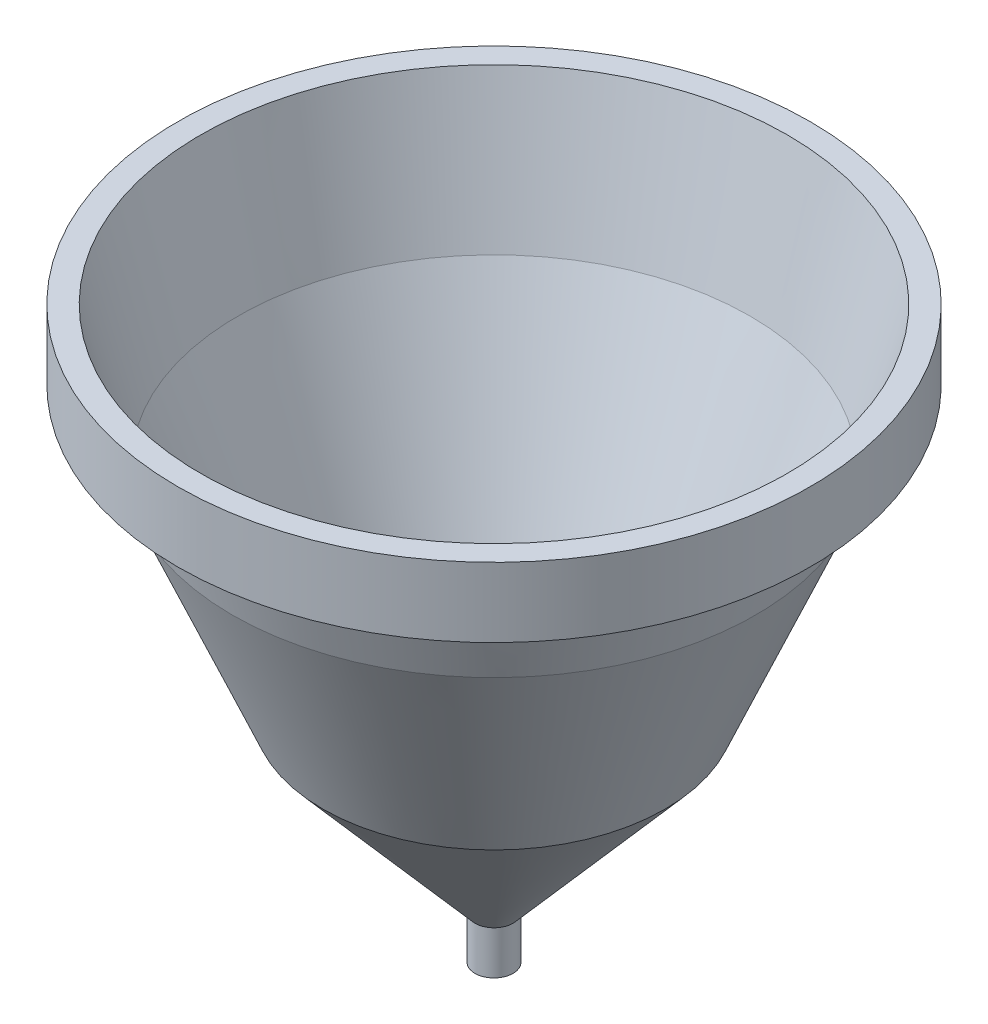
ISO-10303-21;
HEADER;
FILE_DESCRIPTION(('STEP AP214'),'2;1');
FILE_NAME('part.step','',(''),(''),'','','');
FILE_SCHEMA(('AUTOMOTIVE_DESIGN { 1 0 10303 214 1 1 1 1 }'));
ENDSEC;
DATA;
#1=APPLICATION_CONTEXT('core data for automotive mechanical design processes');
#2=APPLICATION_PROTOCOL_DEFINITION('international standard','automotive_design',2000,#1);
#3=PRODUCT_CONTEXT('',#1,'mechanical');
#4=PRODUCT('Part','Part','',(#3));
#5=PRODUCT_RELATED_PRODUCT_CATEGORY('part','',(#4));
#6=PRODUCT_DEFINITION_FORMATION('','',#4);
#7=PRODUCT_DEFINITION_CONTEXT('part definition',#1,'design');
#8=PRODUCT_DEFINITION('design','',#6,#7);
#9=PRODUCT_DEFINITION_SHAPE('','',#8);
#10=(LENGTH_UNIT() NAMED_UNIT(*) SI_UNIT(.MILLI.,.METRE.));
#11=(NAMED_UNIT(*) PLANE_ANGLE_UNIT() SI_UNIT($,.RADIAN.));
#12=(NAMED_UNIT(*) SI_UNIT($,.STERADIAN.) SOLID_ANGLE_UNIT());
#13=UNCERTAINTY_MEASURE_WITH_UNIT(LENGTH_MEASURE(1.E-05),#10,'distance_accuracy_value','');
#14=(GEOMETRIC_REPRESENTATION_CONTEXT(3) GLOBAL_UNCERTAINTY_ASSIGNED_CONTEXT((#13)) GLOBAL_UNIT_ASSIGNED_CONTEXT((#10,
#11,#12)) REPRESENTATION_CONTEXT('',''));
#15=CARTESIAN_POINT('',(0.,0.,0.));
#16=DIRECTION('',(0.,0.,1.));
#17=DIRECTION('',(1.,0.,0.));
#18=AXIS2_PLACEMENT_3D('',#15,#16,#17);
#19=CARTESIAN_POINT('',(0.,-3.39281603613767,-30.7702271495571));
#20=DIRECTION('',(0.,-1.,0.));
#21=DIRECTION('',(0.,0.,-1.));
#22=AXIS2_PLACEMENT_3D('',#19,#20,#21);
#23=CYLINDRICAL_SURFACE('',#22,6.57712423259411);
#24=CARTESIAN_POINT('',(0.,-3.2622655549078,-30.7702271495571));
#25=DIRECTION('',(0.,-1.,0.));
#26=DIRECTION('',(0.,0.,-1.));
#27=AXIS2_PLACEMENT_3D('',#24,#25,#26);
#28=CIRCLE('',#27,6.57712423259412);
#29=CARTESIAN_POINT('',(0.,-3.2622655549078,-37.3473513821513));
#30=VERTEX_POINT('',#29);
#31=EDGE_CURVE('E10',#30,#30,#28,.T.);
#32=ORIENTED_EDGE('',*,*,#31,.F.);
#33=EDGE_LOOP('',(#32));
#34=FACE_BOUND('',#33,.T.);
#35=CARTESIAN_POINT('',(0.,11.7377344450922,-30.7702271495571));
#36=DIRECTION('',(0.,-1.,0.));
#37=DIRECTION('',(0.,0.,-1.));
#38=AXIS2_PLACEMENT_3D('',#35,#36,#37);
#39=CIRCLE('',#38,6.57712423259411);
#40=CARTESIAN_POINT('',(0.,11.7377344450922,-24.193102916963));
#41=VERTEX_POINT('',#40);
#42=EDGE_CURVE('E82',#41,#41,#39,.T.);
#43=ORIENTED_EDGE('',*,*,#42,.T.);
#44=EDGE_LOOP('',(#43));
#45=FACE_BOUND('',#44,.T.);
#46=ADVANCED_FACE('F36',(#34,#45),#23,.T.);
#47=CARTESIAN_POINT('',(0.,-3.2622655549078,-30.7702271495571));
#48=DIRECTION('',(0.,1.,0.));
#49=DIRECTION('',(0.,0.,1.));
#50=AXIS2_PLACEMENT_3D('',#47,#48,#49);
#51=CONICAL_SURFACE('',#50,6.57712423259412,1.48820706982176);
#52=CARTESIAN_POINT('',(0.,-3.39281603613767,-30.7702271495571));
#53=DIRECTION('',(0.,-1.,0.));
#54=DIRECTION('',(0.,0.,-1.));
#55=AXIS2_PLACEMENT_3D('',#52,#53,#54);
#56=CIRCLE('',#55,4.99999999999997);
#57=CARTESIAN_POINT('',(0.,-3.39281603613767,-35.7702271495571));
#58=VERTEX_POINT('',#57);
#59=EDGE_CURVE('E42',#58,#58,#56,.T.);
#60=ORIENTED_EDGE('',*,*,#59,.F.);
#61=EDGE_LOOP('',(#60));
#62=FACE_BOUND('',#61,.T.);
#63=ORIENTED_EDGE('',*,*,#31,.T.);
#64=EDGE_LOOP('',(#63));
#65=FACE_BOUND('',#64,.T.);
#66=ADVANCED_FACE('F123',(#62,#65),#51,.T.);
#67=CARTESIAN_POINT('',(0.,-3.39281603613767,-30.7702271495571));
#68=DIRECTION('',(0.,-1.,0.));
#69=DIRECTION('',(0.,0.,-1.));
#70=AXIS2_PLACEMENT_3D('',#67,#68,#69);
#71=CYLINDRICAL_SURFACE('',#70,4.99999999999997);
#72=ORIENTED_EDGE('',*,*,#59,.T.);
#73=EDGE_LOOP('',(#72));
#74=FACE_BOUND('',#73,.T.);
#75=CARTESIAN_POINT('',(0.,12.4071839638624,-30.7702271495571));
#76=DIRECTION('',(0.,-1.,0.));
#77=DIRECTION('',(0.,0.,-1.));
#78=AXIS2_PLACEMENT_3D('',#75,#76,#77);
#79=CIRCLE('',#78,4.99999999999998);
#80=CARTESIAN_POINT('',(0.,12.4071839638624,-25.7702271495572));
#81=VERTEX_POINT('',#80);
#82=EDGE_CURVE('E46',#81,#81,#79,.T.);
#83=ORIENTED_EDGE('',*,*,#82,.F.);
#84=EDGE_LOOP('',(#83));
#85=FACE_BOUND('',#84,.T.);
#86=ADVANCED_FACE('F128',(#74,#85),#71,.F.);
#87=CARTESIAN_POINT('',(0.,72.783950381684,-30.7702271495571));
#88=DIRECTION('',(0.,1.,0.));
#89=DIRECTION('',(0.,0.,1.));
#90=AXIS2_PLACEMENT_3D('',#87,#88,#89);
#91=CONICAL_SURFACE('',#90,57.4847223192407,0.715584993317677);
#92=CARTESIAN_POINT('',(0.,72.783950381684,-30.7702271495571));
#93=DIRECTION('',(0.,-1.,0.));
#94=DIRECTION('',(0.,0.,-1.));
#95=AXIS2_PLACEMENT_3D('',#92,#93,#94);
#96=CIRCLE('',#95,57.4847223192407);
#97=CARTESIAN_POINT('',(0.,72.783950381684,26.7144951696836));
#98=VERTEX_POINT('',#97);
#99=EDGE_CURVE('E50',#98,#98,#96,.T.);
#100=CARTESIAN_POINT('',(0.,12.4071839638624,-25.7702271495572));
#101=CARTESIAN_POINT('',(0.,13.036108614048,-25.2235112920651));
#102=CARTESIAN_POINT('',(0.,13.6650332642336,-24.676795434573));
#103=CARTESIAN_POINT('',(0.,14.9228825646049,-23.5833637195888));
#104=CARTESIAN_POINT('',(0.,15.5518072147906,-23.0366478620967));
#105=CARTESIAN_POINT('',(0.,16.8096565151618,-21.9432161471125));
#106=CARTESIAN_POINT('',(0.,17.4385811653475,-21.3965002896204));
#107=CARTESIAN_POINT('',(0.,18.6964304657188,-20.3030685746363));
#108=CARTESIAN_POINT('',(0.,19.3253551159044,-19.7563527171442));
#109=CARTESIAN_POINT('',(0.,20.5832044162757,-18.66292100216));
#110=CARTESIAN_POINT('',(0.,21.2121290664613,-18.1162051446679));
#111=CARTESIAN_POINT('',(0.,22.4699783668326,-17.0227734296837));
#112=CARTESIAN_POINT('',(0.,23.0989030170183,-16.4760575721916));
#113=CARTESIAN_POINT('',(0.,24.3567523173896,-15.3826258572074));
#114=CARTESIAN_POINT('',(0.,24.9856769675752,-14.8359099997154));
#115=CARTESIAN_POINT('',(0.,26.2435262679465,-13.7424782847312));
#116=CARTESIAN_POINT('',(0.,26.8724509181321,-13.1957624272391));
#117=CARTESIAN_POINT('',(0.,28.1303002185034,-12.1023307122549));
#118=CARTESIAN_POINT('',(0.,28.7592248686891,-11.5556148547628));
#119=CARTESIAN_POINT('',(0.,30.0170741690603,-10.4621831397786));
#120=CARTESIAN_POINT('',(0.,30.645998819246,-9.91546728228653));
#121=CARTESIAN_POINT('',(0.,31.9038481196173,-8.82203556730235));
#122=CARTESIAN_POINT('',(0.,32.5327727698029,-8.27531970981026));
#123=CARTESIAN_POINT('',(0.,33.7906220701742,-7.18188799482608));
#124=CARTESIAN_POINT('',(0.,34.4195467203598,-6.63517213733398));
#125=CARTESIAN_POINT('',(0.,35.6773960207311,-5.5417404223498));
#126=CARTESIAN_POINT('',(0.,36.3063206709168,-4.99502456485771));
#127=CARTESIAN_POINT('',(0.,37.564169971288,-3.90159284987353));
#128=CARTESIAN_POINT('',(0.,38.1930946214737,-3.35487699238144));
#129=CARTESIAN_POINT('',(0.,39.450943921845,-2.26144527739725));
#130=CARTESIAN_POINT('',(0.,40.0798685720306,-1.71472941990516));
#131=CARTESIAN_POINT('',(0.,41.3377178724019,-0.621297704920985));
#132=CARTESIAN_POINT('',(0.,41.9666425225875,-0.0745818474288936));
#133=CARTESIAN_POINT('',(0.,43.2244918229588,1.01884986755529));
#134=CARTESIAN_POINT('',(0.,43.8534164731445,1.56556572504738));
#135=CARTESIAN_POINT('',(0.,45.1112657735158,2.65899744003157));
#136=CARTESIAN_POINT('',(0.,45.7401904237014,3.20571329752366));
#137=CARTESIAN_POINT('',(0.,46.9980397240727,4.29914501250783));
#138=CARTESIAN_POINT('',(0.,47.6269643742583,4.84586086999992));
#139=CARTESIAN_POINT('',(0.,48.8848136746296,5.9392925849841));
#140=CARTESIAN_POINT('',(0.,49.5137383248152,6.4860084424762));
#141=CARTESIAN_POINT('',(0.,50.7715876251865,7.57944015746038));
#142=CARTESIAN_POINT('',(0.,51.4005122753722,8.12615601495248));
#143=CARTESIAN_POINT('',(0.,52.6583615757435,9.21958772993666));
#144=CARTESIAN_POINT('',(0.,53.2872862259291,9.76630358742874));
#145=CARTESIAN_POINT('',(0.,54.5451355263004,10.8597353024129));
#146=CARTESIAN_POINT('',(0.,55.174060176486,11.406451159905));
#147=CARTESIAN_POINT('',(0.,56.4319094768573,12.4998828748892));
#148=CARTESIAN_POINT('',(0.,57.060834127043,13.0465987323813));
#149=CARTESIAN_POINT('',(0.,58.3186834274142,14.1400304473655));
#150=CARTESIAN_POINT('',(0.,58.9476080775999,14.6867463048576));
#151=CARTESIAN_POINT('',(0.,60.2054573779712,15.7801780198417));
#152=CARTESIAN_POINT('',(0.,60.8343820281568,16.3268938773338));
#153=CARTESIAN_POINT('',(0.,62.0922313285281,17.420325592318));
#154=CARTESIAN_POINT('',(0.,62.7211559787137,17.9670414498101));
#155=CARTESIAN_POINT('',(0.,63.979005279085,19.0604731647943));
#156=CARTESIAN_POINT('',(0.,64.6079299292707,19.6071890222864));
#157=CARTESIAN_POINT('',(0.,65.8657792296419,20.7006207372706));
#158=CARTESIAN_POINT('',(0.,66.4947038798276,21.2473365947627));
#159=CARTESIAN_POINT('',(0.,67.7525531801989,22.3407683097468));
#160=CARTESIAN_POINT('',(0.,68.3814778303845,22.8874841672389));
#161=CARTESIAN_POINT('',(0.,69.6393271307558,23.9809158822231));
#162=CARTESIAN_POINT('',(0.,70.2682517809414,24.5276317397152));
#163=CARTESIAN_POINT('',(0.,71.5261010813127,25.6210634546994));
#164=CARTESIAN_POINT('',(0.,72.1550257314984,26.1677793121915));
#165=CARTESIAN_POINT('',(0.,72.783950381684,26.7144951696836));
#166=B_SPLINE_CURVE_WITH_KNOTS('',3,(#100,#101,#102,#103,#104,#105,#106,#107,#108,#109,#110,
#111,#112,#113,#114,#115,#116,#117,#118,#119,#120,#121,#122,#123,#124,#125,#126,#127,#128,#129,
#130,#131,#132,#133,#134,#135,#136,#137,#138,#139,#140,#141,#142,#143,#144,#145,#146,#147,#148,
#149,#150,#151,#152,#153,#154,#155,#156,#157,#158,#159,#160,#161,#162,#163,#164,#165),
.UNSPECIFIED.,.F.,.F.,(4,2,2,2,2,2,2,2,2,2,2,2,2,2,2,2,2,2,2,2,2,2,2,2,2,2,2,2,2,2,2,2,4),(0.,
2.5,5.,7.5,10.,12.5,15.,17.5,20.,22.5,25.,27.5,30.,32.5,35.,37.5,40.,42.5,45.,47.5,50.,52.5,55.,
57.5,60.,62.5,65.,67.5,70.,72.5,75.,77.5,80.),.UNSPECIFIED.);
#167=EDGE_CURVE('BSEAM133',#81,#98,#166,.T.);
#168=ORIENTED_EDGE('',*,*,#82,.T.);
#169=ORIENTED_EDGE('',*,*,#99,.F.);
#170=ORIENTED_EDGE('',*,*,#167,.T.);
#171=ORIENTED_EDGE('',*,*,#167,.F.);
#172=EDGE_LOOP('',(#168,#170,#169,#171));
#173=FACE_BOUND('',#172,.T.);
#174=ADVANCED_FACE('F133',(#173),#91,.F.);
#175=CARTESIAN_POINT('',(0.,145.754889139109,-30.7702271495571));
#176=DIRECTION('',(0.,1.,0.));
#177=DIRECTION('',(0.,0.,1.));
#178=AXIS2_PLACEMENT_3D('',#175,#176,#177);
#179=CONICAL_SURFACE('',#178,88.4590481369411,0.401425727958697);
#180=ORIENTED_EDGE('',*,*,#99,.T.);
#181=EDGE_LOOP('',(#180));
#182=FACE_BOUND('',#181,.T.);
#183=CARTESIAN_POINT('',(0.,145.754889139109,-30.7702271495571));
#184=DIRECTION('',(0.,-1.,0.));
#185=DIRECTION('',(0.,0.,-1.));
#186=AXIS2_PLACEMENT_3D('',#183,#184,#185);
#187=CIRCLE('',#186,88.4590481369411);
#188=CARTESIAN_POINT('',(0.,145.754889139109,-119.229275286498));
#189=VERTEX_POINT('',#188);
#190=EDGE_CURVE('E55',#189,#189,#187,.T.);
#191=ORIENTED_EDGE('',*,*,#190,.F.);
#192=EDGE_LOOP('',(#191));
#193=FACE_BOUND('',#192,.T.);
#194=ADVANCED_FACE('F138',(#182,#193),#179,.F.);
#195=CARTESIAN_POINT('',(0.,193.562293059226,-30.7702271495571));
#196=DIRECTION('',(0.,1.,0.));
#197=DIRECTION('',(0.,0.,1.));
#198=AXIS2_PLACEMENT_3D('',#195,#196,#197);
#199=CONICAL_SURFACE('',#198,101.269003409565,0.26179938779915);
#200=ORIENTED_EDGE('',*,*,#190,.T.);
#201=EDGE_LOOP('',(#200));
#202=FACE_BOUND('',#201,.T.);
#203=CARTESIAN_POINT('',(0.,193.562293059226,-30.7702271495571));
#204=DIRECTION('',(0.,-1.,0.));
#205=DIRECTION('',(0.,0.,-1.));
#206=AXIS2_PLACEMENT_3D('',#203,#204,#205);
#207=CIRCLE('',#206,101.269003409565);
#208=CARTESIAN_POINT('',(0.,193.562293059226,-132.039230559122));
#209=VERTEX_POINT('',#208);
#210=EDGE_CURVE('E58',#209,#209,#207,.T.);
#211=ORIENTED_EDGE('',*,*,#210,.F.);
#212=EDGE_LOOP('',(#211));
#213=FACE_BOUND('',#212,.T.);
#214=ADVANCED_FACE('F142',(#202,#213),#199,.F.);
#215=CARTESIAN_POINT('',(0.,193.562293059226,0.));
#216=DIRECTION('',(0.,-1.,0.));
#217=DIRECTION('',(0.,0.,-1.));
#218=AXIS2_PLACEMENT_3D('',#215,#216,#217);
#219=PLANE('',#218);
#220=CARTESIAN_POINT('',(0.,193.562293059226,-30.7702271495571));
#221=DIRECTION('',(0.,-1.,0.));
#222=DIRECTION('',(0.,0.,-1.));
#223=AXIS2_PLACEMENT_3D('',#220,#221,#222);
#224=CIRCLE('',#223,109.179003409565);
#225=CARTESIAN_POINT('',(0.,193.562293059226,-139.949230559122));
#226=VERTEX_POINT('',#225);
#227=EDGE_CURVE('E61',#226,#226,#224,.T.);
#228=ORIENTED_EDGE('',*,*,#227,.F.);
#229=EDGE_LOOP('',(#228));
#230=FACE_BOUND('',#229,.T.);
#231=ORIENTED_EDGE('',*,*,#210,.T.);
#232=EDGE_LOOP('',(#231));
#233=FACE_BOUND('',#232,.T.);
#234=ADVANCED_FACE('F146',(#230,#233),#219,.F.);
#235=CARTESIAN_POINT('',(0.,-3.39281603613767,-30.7702271495571));
#236=DIRECTION('',(0.,-1.,0.));
#237=DIRECTION('',(0.,0.,-1.));
#238=AXIS2_PLACEMENT_3D('',#235,#236,#237);
#239=CYLINDRICAL_SURFACE('',#238,109.179003409565);
#240=ORIENTED_EDGE('',*,*,#227,.T.);
#241=EDGE_LOOP('',(#240));
#242=FACE_BOUND('',#241,.T.);
#243=CARTESIAN_POINT('',(0.,169.562293059226,-30.7702271495571));
#244=DIRECTION('',(0.,-1.,0.));
#245=DIRECTION('',(0.,0.,-1.));
#246=AXIS2_PLACEMENT_3D('',#243,#244,#245);
#247=CIRCLE('',#246,109.179003409565);
#248=CARTESIAN_POINT('',(0.,169.562293059226,-139.949230559122));
#249=VERTEX_POINT('',#248);
#250=EDGE_CURVE('E64',#249,#249,#247,.T.);
#251=ORIENTED_EDGE('',*,*,#250,.F.);
#252=EDGE_LOOP('',(#251));
#253=FACE_BOUND('',#252,.T.);
#254=ADVANCED_FACE('F119',(#242,#253),#239,.T.);
#255=CARTESIAN_POINT('',(0.,169.562293059226,0.));
#256=DIRECTION('',(0.,-1.,0.));
#257=DIRECTION('',(0.,0.,-1.));
#258=AXIS2_PLACEMENT_3D('',#255,#256,#257);
#259=PLANE('',#258);
#260=ORIENTED_EDGE('',*,*,#250,.T.);
#261=EDGE_LOOP('',(#260));
#262=FACE_BOUND('',#261,.T.);
#263=CARTESIAN_POINT('',(0.,169.562293059226,-30.7702271495571));
#264=DIRECTION('',(0.,-1.,0.));
#265=DIRECTION('',(0.,0.,-1.));
#266=AXIS2_PLACEMENT_3D('',#263,#264,#265);
#267=CIRCLE('',#266,107.379003409565);
#268=CARTESIAN_POINT('',(0.,169.562293059226,-138.149230559122));
#269=VERTEX_POINT('',#268);
#270=EDGE_CURVE('E67',#269,#269,#267,.T.);
#271=ORIENTED_EDGE('',*,*,#270,.F.);
#272=EDGE_LOOP('',(#271));
#273=FACE_BOUND('',#272,.T.);
#274=ADVANCED_FACE('F113',(#262,#273),#259,.T.);
#275=CARTESIAN_POINT('',(0.,-3.39281603613767,-30.7702271495571));
#276=DIRECTION('',(0.,-1.,0.));
#277=DIRECTION('',(0.,0.,-1.));
#278=AXIS2_PLACEMENT_3D('',#275,#276,#277);
#279=CYLINDRICAL_SURFACE('',#278,107.379003409565);
#280=ORIENTED_EDGE('',*,*,#270,.T.);
#281=EDGE_LOOP('',(#280));
#282=FACE_BOUND('',#281,.T.);
#283=CARTESIAN_POINT('',(0.,179.562293059227,-30.7702271495571));
#284=DIRECTION('',(0.,-1.,0.));
#285=DIRECTION('',(0.,0.,-1.));
#286=AXIS2_PLACEMENT_3D('',#283,#284,#285);
#287=CIRCLE('',#286,107.379003409565);
#288=CARTESIAN_POINT('',(0.,179.562293059227,-138.149230559122));
#289=VERTEX_POINT('',#288);
#290=EDGE_CURVE('E70',#289,#289,#287,.T.);
#291=ORIENTED_EDGE('',*,*,#290,.F.);
#292=EDGE_LOOP('',(#291));
#293=FACE_BOUND('',#292,.T.);
#294=ADVANCED_FACE('F108',(#282,#293),#279,.F.);
#295=CARTESIAN_POINT('',(0.,179.562293059227,0.));
#296=DIRECTION('',(0.,1.,0.));
#297=DIRECTION('',(0.,0.,1.));
#298=AXIS2_PLACEMENT_3D('',#295,#296,#297);
#299=PLANE('',#298);
#300=CARTESIAN_POINT('',(0.,179.562293059227,-30.7702271495571));
#301=DIRECTION('',(0.,-1.,0.));
#302=DIRECTION('',(0.,0.,-1.));
#303=AXIS2_PLACEMENT_3D('',#300,#301,#302);
#304=CIRCLE('',#303,99.3790034095651);
#305=CARTESIAN_POINT('',(0.,179.562293059227,-130.149230559122));
#306=VERTEX_POINT('',#305);
#307=EDGE_CURVE('E73',#306,#306,#304,.T.);
#308=ORIENTED_EDGE('',*,*,#307,.F.);
#309=EDGE_LOOP('',(#308));
#310=FACE_BOUND('',#309,.T.);
#311=ORIENTED_EDGE('',*,*,#290,.T.);
#312=EDGE_LOOP('',(#311));
#313=FACE_BOUND('',#312,.T.);
#314=ADVANCED_FACE('F102',(#310,#313),#299,.F.);
#315=CARTESIAN_POINT('',(0.,179.562293059227,-30.7702271495571));
#316=DIRECTION('',(0.,1.,0.));
#317=DIRECTION('',(0.,0.,1.));
#318=AXIS2_PLACEMENT_3D('',#315,#316,#317);
#319=CONICAL_SURFACE('',#318,99.3790034095651,0.261799387799151);
#320=CARTESIAN_POINT('',(0.,145.754889139109,-30.7702271495571));
#321=DIRECTION('',(0.,-1.,0.));
#322=DIRECTION('',(0.,0.,-1.));
#323=AXIS2_PLACEMENT_3D('',#320,#321,#322);
#324=CIRCLE('',#323,90.3203368309768);
#325=CARTESIAN_POINT('',(0.,145.754889139109,-121.090563980534));
#326=VERTEX_POINT('',#325);
#327=EDGE_CURVE('E76',#326,#326,#324,.T.);
#328=ORIENTED_EDGE('',*,*,#327,.F.);
#329=EDGE_LOOP('',(#328));
#330=FACE_BOUND('',#329,.T.);
#331=ORIENTED_EDGE('',*,*,#307,.T.);
#332=EDGE_LOOP('',(#331));
#333=FACE_BOUND('',#332,.T.);
#334=ADVANCED_FACE('F96',(#330,#333),#319,.T.);
#335=CARTESIAN_POINT('',(0.,145.754889139109,-30.7702271495571));
#336=DIRECTION('',(0.,1.,0.));
#337=DIRECTION('',(0.,0.,1.));
#338=AXIS2_PLACEMENT_3D('',#335,#336,#337);
#339=CONICAL_SURFACE('',#338,90.3203368309768,0.401425727958697);
#340=CARTESIAN_POINT('',(0.,72.1145008629139,-30.7702271495571));
#341=DIRECTION('',(0.,-1.,0.));
#342=DIRECTION('',(0.,0.,-1.));
#343=AXIS2_PLACEMENT_3D('',#340,#341,#342);
#344=CIRCLE('',#343,59.0618465518349);
#345=CARTESIAN_POINT('',(0.,72.1145008629139,28.2916194022777));
#346=VERTEX_POINT('',#345);
#347=EDGE_CURVE('E79',#346,#346,#344,.T.);
#348=ORIENTED_EDGE('',*,*,#347,.F.);
#349=EDGE_LOOP('',(#348));
#350=FACE_BOUND('',#349,.T.);
#351=ORIENTED_EDGE('',*,*,#327,.T.);
#352=EDGE_LOOP('',(#351));
#353=FACE_BOUND('',#352,.T.);
#354=ADVANCED_FACE('F90',(#350,#353),#339,.T.);
#355=CARTESIAN_POINT('',(0.,72.1145008629139,-30.7702271495571));
#356=DIRECTION('',(0.,1.,0.));
#357=DIRECTION('',(0.,0.,1.));
#358=AXIS2_PLACEMENT_3D('',#355,#356,#357);
#359=CONICAL_SURFACE('',#358,59.0618465518349,0.715584993317677);
#360=CARTESIAN_POINT('',(0.,11.7377344450922,-24.193102916963));
#361=CARTESIAN_POINT('',(0.,12.3666590952778,-23.6463870594709));
#362=CARTESIAN_POINT('',(0.,12.9955837454635,-23.0996712019789));
#363=CARTESIAN_POINT('',(0.,14.2534330458348,-22.0062394869947));
#364=CARTESIAN_POINT('',(0.,14.8823576960204,-21.4595236295026));
#365=CARTESIAN_POINT('',(0.,16.1402069963917,-20.3660919145184));
#366=CARTESIAN_POINT('',(0.,16.7691316465773,-19.8193760570263));
#367=CARTESIAN_POINT('',(0.,18.0269809469486,-18.7259443420421));
#368=CARTESIAN_POINT('',(0.,18.6559055971343,-18.17922848455));
#369=CARTESIAN_POINT('',(0.,19.9137548975056,-17.0857967695659));
#370=CARTESIAN_POINT('',(0.,20.5426795476912,-16.5390809120738));
#371=CARTESIAN_POINT('',(0.,21.8005288480625,-15.4456491970896));
#372=CARTESIAN_POINT('',(0.,22.4294534982481,-14.8989333395975));
#373=CARTESIAN_POINT('',(0.,23.6873027986194,-13.8055016246133));
#374=CARTESIAN_POINT('',(0.,24.316227448805,-13.2587857671212));
#375=CARTESIAN_POINT('',(0.,25.5740767491763,-12.165354052137));
#376=CARTESIAN_POINT('',(0.,26.203001399362,-11.6186381946449));
#377=CARTESIAN_POINT('',(0.,27.4608506997333,-10.5252064796608));
#378=CARTESIAN_POINT('',(0.,28.0897753499189,-9.97849062216867));
#379=CARTESIAN_POINT('',(0.,29.3476246502902,-8.88505890718448));
#380=CARTESIAN_POINT('',(0.,29.9765493004758,-8.33834304969239));
#381=CARTESIAN_POINT('',(0.,31.2343986008471,-7.24491133470821));
#382=CARTESIAN_POINT('',(0.,31.8633232510328,-6.69819547721612));
#383=CARTESIAN_POINT('',(0.,33.121172551404,-5.60476376223193));
#384=CARTESIAN_POINT('',(0.,33.7500972015897,-5.05804790473984));
#385=CARTESIAN_POINT('',(0.,35.007946501961,-3.96461618975566));
#386=CARTESIAN_POINT('',(0.,35.6368711521466,-3.41790033226357));
#387=CARTESIAN_POINT('',(0.,36.8947204525179,-2.32446861727939));
#388=CARTESIAN_POINT('',(0.,37.5236451027035,-1.7777527597873));
#389=CARTESIAN_POINT('',(0.,38.7814944030748,-0.684321044803114));
#390=CARTESIAN_POINT('',(0.,39.4104190532605,-0.137605187311023));
#391=CARTESIAN_POINT('',(0.,40.6682683536318,0.95582652767316));
#392=CARTESIAN_POINT('',(0.,41.2971930038174,1.50254238516525));
#393=CARTESIAN_POINT('',(0.,42.5550423041887,2.59597410014944));
#394=CARTESIAN_POINT('',(0.,43.1839669543743,3.14268995764153));
#395=CARTESIAN_POINT('',(0.,44.4418162547456,4.23612167262571));
#396=CARTESIAN_POINT('',(0.,45.0707409049313,4.7828375301178));
#397=CARTESIAN_POINT('',(0.,46.3285902053025,5.87626924510199));
#398=CARTESIAN_POINT('',(0.,46.9575148554882,6.42298510259408));
#399=CARTESIAN_POINT('',(0.,48.2153641558595,7.51641681757825));
#400=CARTESIAN_POINT('',(0.,48.8442888060451,8.06313267507034));
#401=CARTESIAN_POINT('',(0.,50.1021381064164,9.15656439005453));
#402=CARTESIAN_POINT('',(0.,50.731062756602,9.70328024754662));
#403=CARTESIAN_POINT('',(0.,51.9889120569733,10.7967119625308));
#404=CARTESIAN_POINT('',(0.,52.617836707159,11.3434278200229));
#405=CARTESIAN_POINT('',(0.,53.8756860075303,12.4368595350071));
#406=CARTESIAN_POINT('',(0.,54.5046106577159,12.9835753924992));
#407=CARTESIAN_POINT('',(0.,55.7624599580872,14.0770071074834));
#408=CARTESIAN_POINT('',(0.,56.3913846082728,14.6237229649754));
#409=CARTESIAN_POINT('',(0.,57.6492339086441,15.7171546799596));
#410=CARTESIAN_POINT('',(0.,58.2781585588297,16.2638705374517));
#411=CARTESIAN_POINT('',(0.,59.536007859201,17.3573022524359));
#412=CARTESIAN_POINT('',(0.,60.1649325093867,17.904018109928));
#413=CARTESIAN_POINT('',(0.,61.422781809758,18.9974498249122));
#414=CARTESIAN_POINT('',(0.,62.0517064599436,19.5441656824043));
#415=CARTESIAN_POINT('',(0.,63.3095557603149,20.6375973973885));
#416=CARTESIAN_POINT('',(0.,63.9384804105005,21.1843132548805));
#417=CARTESIAN_POINT('',(0.,65.1963297108718,22.2777449698647));
#418=CARTESIAN_POINT('',(0.,65.8252543610574,22.8244608273568));
#419=CARTESIAN_POINT('',(0.,67.0831036614287,23.917892542341));
#420=CARTESIAN_POINT('',(0.,67.7120283116144,24.4646083998331));
#421=CARTESIAN_POINT('',(0.,68.9698776119857,25.5580401148173));
#422=CARTESIAN_POINT('',(0.,69.5988022621713,26.1047559723094));
#423=CARTESIAN_POINT('',(0.,70.8566515625426,27.1981876872935));
#424=CARTESIAN_POINT('',(0.,71.4855762127282,27.7449035447856));
#425=CARTESIAN_POINT('',(0.,72.1145008629139,28.2916194022777));
#426=B_SPLINE_CURVE_WITH_KNOTS('',3,(#360,#361,#362,#363,#364,#365,#366,#367,#368,#369,#370,
#371,#372,#373,#374,#375,#376,#377,#378,#379,#380,#381,#382,#383,#384,#385,#386,#387,#388,#389,
#390,#391,#392,#393,#394,#395,#396,#397,#398,#399,#400,#401,#402,#403,#404,#405,#406,#407,#408,
#409,#410,#411,#412,#413,#414,#415,#416,#417,#418,#419,#420,#421,#422,#423,#424,#425),
.UNSPECIFIED.,.F.,.F.,(4,2,2,2,2,2,2,2,2,2,2,2,2,2,2,2,2,2,2,2,2,2,2,2,2,2,2,2,2,2,2,2,4),(0.,
2.5,5.,7.50000000000001,10.,12.5,15.,17.5,20.,22.5,25.,27.5,30.,32.5,35.,37.5,40.,42.5,45.,47.5,
50.,52.5,55.,57.5,60.,62.5,65.,67.5,70.,72.5,75.,77.5,80.),.UNSPECIFIED.);
#427=EDGE_CURVE('BSEAM87',#41,#346,#426,.T.);
#428=ORIENTED_EDGE('',*,*,#42,.F.);
#429=ORIENTED_EDGE('',*,*,#347,.T.);
#430=ORIENTED_EDGE('',*,*,#427,.T.);
#431=ORIENTED_EDGE('',*,*,#427,.F.);
#432=EDGE_LOOP('',(#428,#430,#429,#431));
#433=FACE_BOUND('',#432,.T.);
#434=ADVANCED_FACE('F87',(#433),#359,.T.);
#435=CLOSED_SHELL('',(#46,#66,#86,#174,#194,#214,#234,#254,#274,#294,#314,#334,#354,#434));
#436=MANIFOLD_SOLID_BREP('B2',#435);
#437=ADVANCED_BREP_SHAPE_REPRESENTATION('',(#18,#436),#14);
#438=SHAPE_DEFINITION_REPRESENTATION(#9,#437);
ENDSEC;
END-ISO-10303-21;
